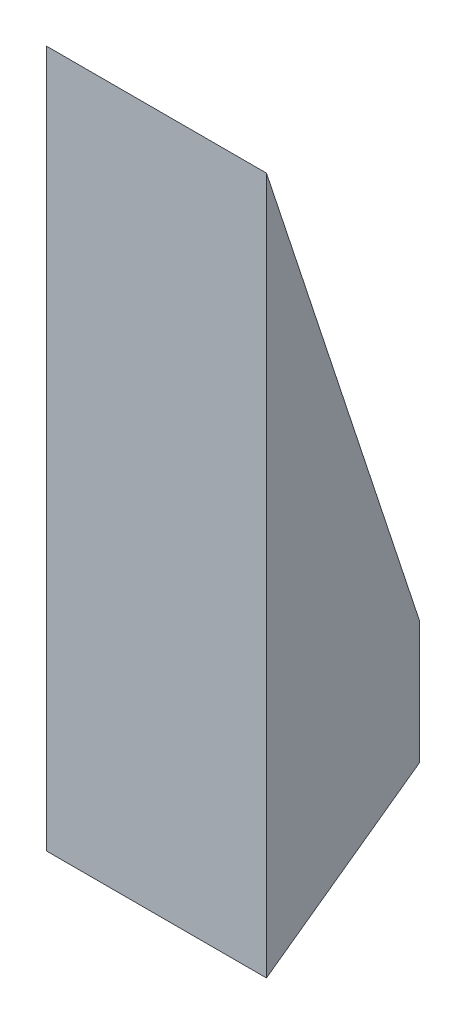
ISO-10303-21;
HEADER;
FILE_DESCRIPTION(('STEP AP214'),'2;1');
FILE_NAME('part.step','',(''),(''),'','','');
FILE_SCHEMA(('AUTOMOTIVE_DESIGN { 1 0 10303 214 1 1 1 1 }'));
ENDSEC;
DATA;
#1=APPLICATION_CONTEXT('core data for automotive mechanical design processes');
#2=APPLICATION_PROTOCOL_DEFINITION('international standard','automotive_design',2000,#1);
#3=PRODUCT_CONTEXT('',#1,'mechanical');
#4=PRODUCT('Part','Part','',(#3));
#5=PRODUCT_RELATED_PRODUCT_CATEGORY('part','',(#4));
#6=PRODUCT_DEFINITION_FORMATION('','',#4);
#7=PRODUCT_DEFINITION_CONTEXT('part definition',#1,'design');
#8=PRODUCT_DEFINITION('design','',#6,#7);
#9=PRODUCT_DEFINITION_SHAPE('','',#8);
#10=(LENGTH_UNIT() NAMED_UNIT(*) SI_UNIT(.MILLI.,.METRE.));
#11=(NAMED_UNIT(*) PLANE_ANGLE_UNIT() SI_UNIT($,.RADIAN.));
#12=(NAMED_UNIT(*) SI_UNIT($,.STERADIAN.) SOLID_ANGLE_UNIT());
#13=UNCERTAINTY_MEASURE_WITH_UNIT(LENGTH_MEASURE(1.E-05),#10,'distance_accuracy_value','');
#14=(GEOMETRIC_REPRESENTATION_CONTEXT(3) GLOBAL_UNCERTAINTY_ASSIGNED_CONTEXT((#13)) GLOBAL_UNIT_ASSIGNED_CONTEXT((#10,
#11,#12)) REPRESENTATION_CONTEXT('',''));
#15=CARTESIAN_POINT('',(0.,0.,0.));
#16=DIRECTION('',(0.,0.,1.));
#17=DIRECTION('',(1.,0.,0.));
#18=AXIS2_PLACEMENT_3D('',#15,#16,#17);
#19=CARTESIAN_POINT('',(-25.1547634408609,172.,0.771428571428577));
#20=DIRECTION('',(0.922618279569573,0.,0.385714285714285));
#21=DIRECTION('',(0.385714285714285,0.,-0.922618279569573));
#22=AXIS2_PLACEMENT_3D('',#19,#20,#21);
#23=PLANE('',#22);
#24=DIRECTION('',(0.171515885688825,-0.895694069708309,-0.410261422078344));
#25=VECTOR('',#24,1.);
#26=CARTESIAN_POINT('',(-29.6584249047305,166.203325145006,11.544066623619));
#27=LINE('',#26,#25);
#28=CARTESIAN_POINT('',(-23.996126531634,136.633544752169,-1.99999999999999));
#29=VERTEX_POINT('',#28);
#30=CARTESIAN_POINT('',(0.,11.3204395314139,-59.3980943846849));
#31=VERTEX_POINT('',#30);
#32=EDGE_CURVE('E63',#29,#31,#27,.T.);
#33=ORIENTED_EDGE('',*,*,#32,.F.);
#34=DIRECTION('',(0.,-1.,0.));
#35=VECTOR('',#34,1.);
#36=CARTESIAN_POINT('',(-23.996126531634,172.,-1.99999999999999));
#37=LINE('',#36,#35);
#38=CARTESIAN_POINT('',(-23.996126531634,2.,-1.99999999999999));
#39=VERTEX_POINT('',#38);
#40=EDGE_CURVE('E127',#29,#39,#37,.T.);
#41=ORIENTED_EDGE('',*,*,#40,.T.);
#42=DIRECTION('',(-0.385714285714285,0.,0.922618279569573));
#43=VECTOR('',#42,1.);
#44=CARTESIAN_POINT('',(-25.1547634408609,2.,0.771428571428577));
#45=LINE('',#44,#43);
#46=CARTESIAN_POINT('',(0.,2.,-59.3980943846849));
#47=VERTEX_POINT('',#46);
#48=EDGE_CURVE('E190',#47,#39,#45,.T.);
#49=ORIENTED_EDGE('',*,*,#48,.F.);
#50=DIRECTION('',(0.,-1.,0.));
#51=VECTOR('',#50,1.);
#52=CARTESIAN_POINT('',(0.,172.,-59.3980943846849));
#53=LINE('',#52,#51);
#54=EDGE_CURVE('E70',#31,#47,#53,.T.);
#55=ORIENTED_EDGE('',*,*,#54,.F.);
#56=EDGE_LOOP('',(#33,#41,#49,#55));
#57=FACE_BOUND('',#56,.T.);
#58=ADVANCED_FACE('F45',(#57),#23,.T.);
#59=CARTESIAN_POINT('',(27.,172.,-2.00000000000001));
#60=DIRECTION('',(0.,0.,-1.));
#61=DIRECTION('',(-1.,0.,0.));
#62=AXIS2_PLACEMENT_3D('',#59,#60,#61);
#63=PLANE('',#62);
#64=DIRECTION('',(-1.,0.,0.));
#65=VECTOR('',#64,1.);
#66=CARTESIAN_POINT('',(27.,136.633544752169,-2.00000000000001));
#67=LINE('',#66,#65);
#68=CARTESIAN_POINT('',(23.9961265316339,136.633544752169,-2.00000000000001));
#69=VERTEX_POINT('',#68);
#70=EDGE_CURVE('E216',#69,#29,#67,.T.);
#71=ORIENTED_EDGE('',*,*,#70,.F.);
#72=DIRECTION('',(0.,-1.,0.));
#73=VECTOR('',#72,1.);
#74=CARTESIAN_POINT('',(23.9961265316339,172.,-2.00000000000001));
#75=LINE('',#74,#73);
#76=CARTESIAN_POINT('',(23.9961265316339,2.,-2.00000000000001));
#77=VERTEX_POINT('',#76);
#78=EDGE_CURVE('E197',#69,#77,#75,.T.);
#79=ORIENTED_EDGE('',*,*,#78,.T.);
#80=DIRECTION('',(1.,0.,0.));
#81=VECTOR('',#80,1.);
#82=CARTESIAN_POINT('',(27.,2.,-2.00000000000001));
#83=LINE('',#82,#81);
#84=EDGE_CURVE('E194',#39,#77,#83,.T.);
#85=ORIENTED_EDGE('',*,*,#84,.F.);
#86=ORIENTED_EDGE('',*,*,#40,.F.);
#87=EDGE_LOOP('',(#71,#79,#85,#86));
#88=FACE_BOUND('',#87,.T.);
#89=ADVANCED_FACE('F215',(#88),#63,.T.);
#90=CARTESIAN_POINT('',(25.1547634408609,172.,0.771428571428562));
#91=DIRECTION('',(-0.922618279569573,0.,0.385714285714286));
#92=DIRECTION('',(0.385714285714286,0.,0.922618279569573));
#93=AXIS2_PLACEMENT_3D('',#90,#91,#92);
#94=PLANE('',#93);
#95=DIRECTION('',(0.171515885688825,0.895694069708309,0.410261422078344));
#96=VECTOR('',#95,1.);
#97=CARTESIAN_POINT('',(29.6584249047305,166.203325145006,11.544066623619));
#98=LINE('',#97,#96);
#99=EDGE_CURVE('E218',#31,#69,#98,.T.);
#100=ORIENTED_EDGE('',*,*,#99,.F.);
#101=ORIENTED_EDGE('',*,*,#54,.T.);
#102=DIRECTION('',(-0.385714285714286,0.,-0.922618279569573));
#103=VECTOR('',#102,1.);
#104=CARTESIAN_POINT('',(25.1547634408609,2.,0.771428571428562));
#105=LINE('',#104,#103);
#106=EDGE_CURVE('E200',#77,#47,#105,.T.);
#107=ORIENTED_EDGE('',*,*,#106,.F.);
#108=ORIENTED_EDGE('',*,*,#78,.F.);
#109=EDGE_LOOP('',(#100,#101,#107,#108));
#110=FACE_BOUND('',#109,.T.);
#111=ADVANCED_FACE('F217',(#110),#94,.T.);
#112=CARTESIAN_POINT('',(0.,2.,0.));
#113=DIRECTION('',(0.,1.,0.));
#114=DIRECTION('',(0.,0.,1.));
#115=AXIS2_PLACEMENT_3D('',#112,#113,#114);
#116=PLANE('',#115);
#117=CARTESIAN_POINT('',(4.16528467062881E-13,2.,-8.78797738539668));
#118=DIRECTION('',(0.,1.,0.));
#119=DIRECTION('',(0.,0.,1.));
#120=AXIS2_PLACEMENT_3D('',#117,#118,#119);
#121=CIRCLE('',#120,3.75);
#122=CARTESIAN_POINT('',(4.16528467062881E-13,2.,-5.03797738539667));
#123=VERTEX_POINT('',#122);
#124=EDGE_CURVE('E49',#123,#123,#121,.F.);
#125=ORIENTED_EDGE('',*,*,#124,.T.);
#126=EDGE_LOOP('',(#125));
#127=FACE_BOUND('',#126,.T.);
#128=CARTESIAN_POINT('',(10.0000000000003,2.,-18.7879773853967));
#129=DIRECTION('',(0.,1.,0.));
#130=DIRECTION('',(0.,0.,1.));
#131=AXIS2_PLACEMENT_3D('',#128,#129,#130);
#132=CIRCLE('',#131,3.75);
#133=CARTESIAN_POINT('',(10.0000000000003,2.,-15.0379773853967));
#134=VERTEX_POINT('',#133);
#135=EDGE_CURVE('E167',#134,#134,#132,.F.);
#136=ORIENTED_EDGE('',*,*,#135,.T.);
#137=EDGE_LOOP('',(#136));
#138=FACE_BOUND('',#137,.T.);
#139=CARTESIAN_POINT('',(-9.99999999999969,2.,-18.7879773853966));
#140=DIRECTION('',(0.,1.,0.));
#141=DIRECTION('',(0.,0.,1.));
#142=AXIS2_PLACEMENT_3D('',#139,#140,#141);
#143=CIRCLE('',#142,3.75);
#144=CARTESIAN_POINT('',(-9.99999999999969,2.,-15.0379773853966));
#145=VERTEX_POINT('',#144);
#146=EDGE_CURVE('E164',#145,#145,#143,.F.);
#147=ORIENTED_EDGE('',*,*,#146,.T.);
#148=EDGE_LOOP('',(#147));
#149=FACE_BOUND('',#148,.T.);
#150=CARTESIAN_POINT('',(-7.99999999999979,2.,-28.7879773853966));
#151=DIRECTION('',(0.,1.,0.));
#152=DIRECTION('',(0.,0.,1.));
#153=AXIS2_PLACEMENT_3D('',#150,#151,#152);
#154=CIRCLE('',#153,3.75);
#155=CARTESIAN_POINT('',(-7.99999999999979,2.,-25.0379773853966));
#156=VERTEX_POINT('',#155);
#157=EDGE_CURVE('E160',#156,#156,#154,.F.);
#158=ORIENTED_EDGE('',*,*,#157,.T.);
#159=EDGE_LOOP('',(#158));
#160=FACE_BOUND('',#159,.T.);
#161=CARTESIAN_POINT('',(0.,2.,-48.7879773853967));
#162=DIRECTION('',(0.,1.,0.));
#163=DIRECTION('',(0.,0.,1.));
#164=AXIS2_PLACEMENT_3D('',#161,#162,#163);
#165=CIRCLE('',#164,3.75);
#166=CARTESIAN_POINT('',(0.,2.,-45.0379773853967));
#167=VERTEX_POINT('',#166);
#168=EDGE_CURVE('E156',#167,#167,#165,.F.);
#169=ORIENTED_EDGE('',*,*,#168,.T.);
#170=EDGE_LOOP('',(#169));
#171=FACE_BOUND('',#170,.T.);
#172=CARTESIAN_POINT('',(1.0413211676572E-13,2.,-38.7879773853967));
#173=DIRECTION('',(0.,1.,0.));
#174=DIRECTION('',(0.,0.,1.));
#175=AXIS2_PLACEMENT_3D('',#172,#173,#174);
#176=CIRCLE('',#175,3.75);
#177=CARTESIAN_POINT('',(1.0413211676572E-13,2.,-35.0379773853967));
#178=VERTEX_POINT('',#177);
#179=EDGE_CURVE('E152',#178,#178,#176,.F.);
#180=ORIENTED_EDGE('',*,*,#179,.T.);
#181=EDGE_LOOP('',(#180));
#182=FACE_BOUND('',#181,.T.);
#183=CARTESIAN_POINT('',(2.08264233531441E-13,2.,-28.7879773853967));
#184=DIRECTION('',(0.,1.,0.));
#185=DIRECTION('',(0.,0.,1.));
#186=AXIS2_PLACEMENT_3D('',#183,#184,#185);
#187=CIRCLE('',#186,3.75);
#188=CARTESIAN_POINT('',(2.08264233531441E-13,2.,-25.0379773853967));
#189=VERTEX_POINT('',#188);
#190=EDGE_CURVE('E148',#189,#189,#187,.F.);
#191=ORIENTED_EDGE('',*,*,#190,.T.);
#192=EDGE_LOOP('',(#191));
#193=FACE_BOUND('',#192,.T.);
#194=CARTESIAN_POINT('',(8.00000000000021,2.,-28.7879773853967));
#195=DIRECTION('',(0.,1.,0.));
#196=DIRECTION('',(0.,0.,1.));
#197=AXIS2_PLACEMENT_3D('',#194,#195,#196);
#198=CIRCLE('',#197,3.75);
#199=CARTESIAN_POINT('',(8.00000000000021,2.,-25.0379773853967));
#200=VERTEX_POINT('',#199);
#201=EDGE_CURVE('E144',#200,#200,#198,.F.);
#202=ORIENTED_EDGE('',*,*,#201,.T.);
#203=EDGE_LOOP('',(#202));
#204=FACE_BOUND('',#203,.T.);
#205=CARTESIAN_POINT('',(-9.99999999999958,2.,-8.78797738539661));
#206=DIRECTION('',(0.,1.,0.));
#207=DIRECTION('',(0.,0.,1.));
#208=AXIS2_PLACEMENT_3D('',#205,#206,#207);
#209=CIRCLE('',#208,3.75);
#210=CARTESIAN_POINT('',(-9.99999999999958,2.,-5.03797738539661));
#211=VERTEX_POINT('',#210);
#212=EDGE_CURVE('E140',#211,#211,#209,.F.);
#213=ORIENTED_EDGE('',*,*,#212,.T.);
#214=EDGE_LOOP('',(#213));
#215=FACE_BOUND('',#214,.T.);
#216=CARTESIAN_POINT('',(10.0000000000004,2.,-8.78797738539668));
#217=DIRECTION('',(0.,1.,0.));
#218=DIRECTION('',(0.,0.,1.));
#219=AXIS2_PLACEMENT_3D('',#216,#217,#218);
#220=CIRCLE('',#219,3.75);
#221=CARTESIAN_POINT('',(10.0000000000004,2.,-5.03797738539668));
#222=VERTEX_POINT('',#221);
#223=EDGE_CURVE('E135',#222,#222,#220,.F.);
#224=ORIENTED_EDGE('',*,*,#223,.T.);
#225=EDGE_LOOP('',(#224));
#226=FACE_BOUND('',#225,.T.);
#227=CARTESIAN_POINT('',(3.12396350297161E-13,2.,-18.7879773853967));
#228=DIRECTION('',(0.,1.,0.));
#229=DIRECTION('',(0.,0.,1.));
#230=AXIS2_PLACEMENT_3D('',#227,#228,#229);
#231=CIRCLE('',#230,3.75);
#232=CARTESIAN_POINT('',(3.12396350297161E-13,2.,-15.0379773853967));
#233=VERTEX_POINT('',#232);
#234=EDGE_CURVE('E131',#233,#233,#231,.F.);
#235=ORIENTED_EDGE('',*,*,#234,.T.);
#236=EDGE_LOOP('',(#235));
#237=FACE_BOUND('',#236,.T.);
#238=ORIENTED_EDGE('',*,*,#48,.T.);
#239=ORIENTED_EDGE('',*,*,#84,.T.);
#240=ORIENTED_EDGE('',*,*,#106,.T.);
#241=EDGE_LOOP('',(#238,#239,#240));
#242=FACE_BOUND('',#241,.T.);
#243=ADVANCED_FACE('F208',(#127,#138,#149,#160,#171,#182,#193,#204,#215,#226,#237,#242),#116,.T.);
#244=CARTESIAN_POINT('',(3.12396350297161E-13,172.,-18.7879773853967));
#245=DIRECTION('',(0.,-1.,0.));
#246=DIRECTION('',(0.,0.,-1.));
#247=AXIS2_PLACEMENT_3D('',#244,#245,#246);
#248=CYLINDRICAL_SURFACE('',#247,3.75);
#249=ORIENTED_EDGE('',*,*,#234,.F.);
#250=EDGE_LOOP('',(#249));
#251=FACE_BOUND('',#250,.T.);
#252=CARTESIAN_POINT('',(3.12396350297161E-13,-23.,-18.7879773853967));
#253=DIRECTION('',(0.,1.,0.));
#254=DIRECTION('',(0.,0.,1.));
#255=AXIS2_PLACEMENT_3D('',#252,#253,#254);
#256=CIRCLE('',#255,3.75);
#257=CARTESIAN_POINT('',(3.12396350297161E-13,-23.,-15.0379773853967));
#258=VERTEX_POINT('',#257);
#259=EDGE_CURVE('E136',#258,#258,#256,.T.);
#260=ORIENTED_EDGE('',*,*,#259,.F.);
#261=EDGE_LOOP('',(#260));
#262=FACE_BOUND('',#261,.T.);
#263=ADVANCED_FACE('F299',(#251,#262),#248,.F.);
#264=CARTESIAN_POINT('',(3.12396350297161E-13,-23.,-18.7879773853967));
#265=DIRECTION('',(0.,1.,0.));
#266=DIRECTION('',(0.,0.,1.));
#267=AXIS2_PLACEMENT_3D('',#264,#265,#266);
#268=PLANE('',#267);
#269=ORIENTED_EDGE('',*,*,#259,.T.);
#270=EDGE_LOOP('',(#269));
#271=FACE_BOUND('',#270,.T.);
#272=ADVANCED_FACE('F329',(#271),#268,.T.);
#273=CARTESIAN_POINT('',(10.0000000000004,172.,-8.78797738539668));
#274=DIRECTION('',(0.,-1.,0.));
#275=DIRECTION('',(0.,0.,-1.));
#276=AXIS2_PLACEMENT_3D('',#273,#274,#275);
#277=CYLINDRICAL_SURFACE('',#276,3.75);
#278=ORIENTED_EDGE('',*,*,#223,.F.);
#279=EDGE_LOOP('',(#278));
#280=FACE_BOUND('',#279,.T.);
#281=CARTESIAN_POINT('',(10.0000000000004,-23.,-8.78797738539668));
#282=DIRECTION('',(0.,1.,0.));
#283=DIRECTION('',(0.,0.,1.));
#284=AXIS2_PLACEMENT_3D('',#281,#282,#283);
#285=CIRCLE('',#284,3.75);
#286=CARTESIAN_POINT('',(10.0000000000004,-23.,-5.03797738539668));
#287=VERTEX_POINT('',#286);
#288=EDGE_CURVE('E110',#287,#287,#285,.T.);
#289=ORIENTED_EDGE('',*,*,#288,.F.);
#290=EDGE_LOOP('',(#289));
#291=FACE_BOUND('',#290,.T.);
#292=ADVANCED_FACE('F326',(#280,#291),#277,.F.);
#293=CARTESIAN_POINT('',(10.0000000000004,-23.,-8.78797738539668));
#294=DIRECTION('',(0.,1.,0.));
#295=DIRECTION('',(0.,0.,1.));
#296=AXIS2_PLACEMENT_3D('',#293,#294,#295);
#297=PLANE('',#296);
#298=ORIENTED_EDGE('',*,*,#288,.T.);
#299=EDGE_LOOP('',(#298));
#300=FACE_BOUND('',#299,.T.);
#301=ADVANCED_FACE('F320',(#300),#297,.T.);
#302=CARTESIAN_POINT('',(-9.99999999999958,172.,-8.78797738539661));
#303=DIRECTION('',(0.,-1.,0.));
#304=DIRECTION('',(0.,0.,-1.));
#305=AXIS2_PLACEMENT_3D('',#302,#303,#304);
#306=CYLINDRICAL_SURFACE('',#305,3.75);
#307=ORIENTED_EDGE('',*,*,#212,.F.);
#308=EDGE_LOOP('',(#307));
#309=FACE_BOUND('',#308,.T.);
#310=CARTESIAN_POINT('',(-9.99999999999958,-23.,-8.78797738539661));
#311=DIRECTION('',(0.,1.,0.));
#312=DIRECTION('',(0.,0.,1.));
#313=AXIS2_PLACEMENT_3D('',#310,#311,#312);
#314=CIRCLE('',#313,3.75);
#315=CARTESIAN_POINT('',(-9.99999999999958,-23.,-5.03797738539661));
#316=VERTEX_POINT('',#315);
#317=EDGE_CURVE('E228',#316,#316,#314,.T.);
#318=ORIENTED_EDGE('',*,*,#317,.F.);
#319=EDGE_LOOP('',(#318));
#320=FACE_BOUND('',#319,.T.);
#321=ADVANCED_FACE('F316',(#309,#320),#306,.F.);
#322=CARTESIAN_POINT('',(-9.99999999999958,-23.,-8.78797738539661));
#323=DIRECTION('',(0.,1.,0.));
#324=DIRECTION('',(0.,0.,1.));
#325=AXIS2_PLACEMENT_3D('',#322,#323,#324);
#326=PLANE('',#325);
#327=ORIENTED_EDGE('',*,*,#317,.T.);
#328=EDGE_LOOP('',(#327));
#329=FACE_BOUND('',#328,.T.);
#330=ADVANCED_FACE('F319',(#329),#326,.T.);
#331=CARTESIAN_POINT('',(8.00000000000021,172.,-28.7879773853967));
#332=DIRECTION('',(0.,-1.,0.));
#333=DIRECTION('',(0.,0.,-1.));
#334=AXIS2_PLACEMENT_3D('',#331,#332,#333);
#335=CYLINDRICAL_SURFACE('',#334,3.75);
#336=ORIENTED_EDGE('',*,*,#201,.F.);
#337=EDGE_LOOP('',(#336));
#338=FACE_BOUND('',#337,.T.);
#339=CARTESIAN_POINT('',(8.00000000000021,-23.,-28.7879773853967));
#340=DIRECTION('',(0.,1.,0.));
#341=DIRECTION('',(0.,0.,1.));
#342=AXIS2_PLACEMENT_3D('',#339,#340,#341);
#343=CIRCLE('',#342,3.75);
#344=CARTESIAN_POINT('',(8.00000000000021,-23.,-25.0379773853967));
#345=VERTEX_POINT('',#344);
#346=EDGE_CURVE('E252',#345,#345,#343,.T.);
#347=ORIENTED_EDGE('',*,*,#346,.F.);
#348=EDGE_LOOP('',(#347));
#349=FACE_BOUND('',#348,.T.);
#350=ADVANCED_FACE('F324',(#338,#349),#335,.F.);
#351=CARTESIAN_POINT('',(8.00000000000021,-23.,-28.7879773853967));
#352=DIRECTION('',(0.,1.,0.));
#353=DIRECTION('',(0.,0.,1.));
#354=AXIS2_PLACEMENT_3D('',#351,#352,#353);
#355=PLANE('',#354);
#356=ORIENTED_EDGE('',*,*,#346,.T.);
#357=EDGE_LOOP('',(#356));
#358=FACE_BOUND('',#357,.T.);
#359=ADVANCED_FACE('F362',(#358),#355,.T.);
#360=CARTESIAN_POINT('',(2.08264233531441E-13,172.,-28.7879773853967));
#361=DIRECTION('',(0.,-1.,0.));
#362=DIRECTION('',(0.,0.,-1.));
#363=AXIS2_PLACEMENT_3D('',#360,#361,#362);
#364=CYLINDRICAL_SURFACE('',#363,3.75);
#365=ORIENTED_EDGE('',*,*,#190,.F.);
#366=EDGE_LOOP('',(#365));
#367=FACE_BOUND('',#366,.T.);
#368=CARTESIAN_POINT('',(2.08264233531441E-13,-23.,-28.7879773853967));
#369=DIRECTION('',(0.,1.,0.));
#370=DIRECTION('',(0.,0.,1.));
#371=AXIS2_PLACEMENT_3D('',#368,#369,#370);
#372=CIRCLE('',#371,3.75);
#373=CARTESIAN_POINT('',(2.08264233531441E-13,-23.,-25.0379773853967));
#374=VERTEX_POINT('',#373);
#375=EDGE_CURVE('E256',#374,#374,#372,.T.);
#376=ORIENTED_EDGE('',*,*,#375,.F.);
#377=EDGE_LOOP('',(#376));
#378=FACE_BOUND('',#377,.T.);
#379=ADVANCED_FACE('F366',(#367,#378),#364,.F.);
#380=CARTESIAN_POINT('',(2.08264233531441E-13,-23.,-28.7879773853967));
#381=DIRECTION('',(0.,1.,0.));
#382=DIRECTION('',(0.,0.,1.));
#383=AXIS2_PLACEMENT_3D('',#380,#381,#382);
#384=PLANE('',#383);
#385=ORIENTED_EDGE('',*,*,#375,.T.);
#386=EDGE_LOOP('',(#385));
#387=FACE_BOUND('',#386,.T.);
#388=ADVANCED_FACE('F370',(#387),#384,.T.);
#389=CARTESIAN_POINT('',(1.0413211676572E-13,172.,-38.7879773853967));
#390=DIRECTION('',(0.,-1.,0.));
#391=DIRECTION('',(0.,0.,-1.));
#392=AXIS2_PLACEMENT_3D('',#389,#390,#391);
#393=CYLINDRICAL_SURFACE('',#392,3.75);
#394=ORIENTED_EDGE('',*,*,#179,.F.);
#395=EDGE_LOOP('',(#394));
#396=FACE_BOUND('',#395,.T.);
#397=CARTESIAN_POINT('',(1.0413211676572E-13,-23.,-38.7879773853967));
#398=DIRECTION('',(0.,1.,0.));
#399=DIRECTION('',(0.,0.,1.));
#400=AXIS2_PLACEMENT_3D('',#397,#398,#399);
#401=CIRCLE('',#400,3.75);
#402=CARTESIAN_POINT('',(1.0413211676572E-13,-23.,-35.0379773853967));
#403=VERTEX_POINT('',#402);
#404=EDGE_CURVE('E260',#403,#403,#401,.T.);
#405=ORIENTED_EDGE('',*,*,#404,.F.);
#406=EDGE_LOOP('',(#405));
#407=FACE_BOUND('',#406,.T.);
#408=ADVANCED_FACE('F280',(#396,#407),#393,.F.);
#409=CARTESIAN_POINT('',(1.0413211676572E-13,-23.,-38.7879773853967));
#410=DIRECTION('',(0.,1.,0.));
#411=DIRECTION('',(0.,0.,1.));
#412=AXIS2_PLACEMENT_3D('',#409,#410,#411);
#413=PLANE('',#412);
#414=ORIENTED_EDGE('',*,*,#404,.T.);
#415=EDGE_LOOP('',(#414));
#416=FACE_BOUND('',#415,.T.);
#417=ADVANCED_FACE('F271',(#416),#413,.T.);
#418=CARTESIAN_POINT('',(0.,172.,-48.7879773853967));
#419=DIRECTION('',(0.,-1.,0.));
#420=DIRECTION('',(0.,0.,-1.));
#421=AXIS2_PLACEMENT_3D('',#418,#419,#420);
#422=CYLINDRICAL_SURFACE('',#421,3.75);
#423=ORIENTED_EDGE('',*,*,#168,.F.);
#424=EDGE_LOOP('',(#423));
#425=FACE_BOUND('',#424,.T.);
#426=CARTESIAN_POINT('',(0.,-23.,-48.7879773853967));
#427=DIRECTION('',(0.,1.,0.));
#428=DIRECTION('',(0.,0.,1.));
#429=AXIS2_PLACEMENT_3D('',#426,#427,#428);
#430=CIRCLE('',#429,3.75);
#431=CARTESIAN_POINT('',(0.,-23.,-45.0379773853967));
#432=VERTEX_POINT('',#431);
#433=EDGE_CURVE('E240',#432,#432,#430,.T.);
#434=ORIENTED_EDGE('',*,*,#433,.F.);
#435=EDGE_LOOP('',(#434));
#436=FACE_BOUND('',#435,.T.);
#437=ADVANCED_FACE('F269',(#425,#436),#422,.F.);
#438=CARTESIAN_POINT('',(0.,-23.,-48.7879773853967));
#439=DIRECTION('',(0.,1.,0.));
#440=DIRECTION('',(0.,0.,1.));
#441=AXIS2_PLACEMENT_3D('',#438,#439,#440);
#442=PLANE('',#441);
#443=ORIENTED_EDGE('',*,*,#433,.T.);
#444=EDGE_LOOP('',(#443));
#445=FACE_BOUND('',#444,.T.);
#446=ADVANCED_FACE('F267',(#445),#442,.T.);
#447=CARTESIAN_POINT('',(-7.99999999999979,172.,-28.7879773853966));
#448=DIRECTION('',(0.,-1.,0.));
#449=DIRECTION('',(0.,0.,-1.));
#450=AXIS2_PLACEMENT_3D('',#447,#448,#449);
#451=CYLINDRICAL_SURFACE('',#450,3.75);
#452=ORIENTED_EDGE('',*,*,#157,.F.);
#453=EDGE_LOOP('',(#452));
#454=FACE_BOUND('',#453,.T.);
#455=CARTESIAN_POINT('',(-7.99999999999979,-23.,-28.7879773853966));
#456=DIRECTION('',(0.,1.,0.));
#457=DIRECTION('',(0.,0.,1.));
#458=AXIS2_PLACEMENT_3D('',#455,#456,#457);
#459=CIRCLE('',#458,3.75);
#460=CARTESIAN_POINT('',(-7.99999999999979,-23.,-25.0379773853966));
#461=VERTEX_POINT('',#460);
#462=EDGE_CURVE('E236',#461,#461,#459,.T.);
#463=ORIENTED_EDGE('',*,*,#462,.F.);
#464=EDGE_LOOP('',(#463));
#465=FACE_BOUND('',#464,.T.);
#466=ADVANCED_FACE('F278',(#454,#465),#451,.F.);
#467=CARTESIAN_POINT('',(-7.99999999999979,-23.,-28.7879773853966));
#468=DIRECTION('',(0.,1.,0.));
#469=DIRECTION('',(0.,0.,1.));
#470=AXIS2_PLACEMENT_3D('',#467,#468,#469);
#471=PLANE('',#470);
#472=ORIENTED_EDGE('',*,*,#462,.T.);
#473=EDGE_LOOP('',(#472));
#474=FACE_BOUND('',#473,.T.);
#475=ADVANCED_FACE('F336',(#474),#471,.T.);
#476=CARTESIAN_POINT('',(-9.99999999999969,172.,-18.7879773853966));
#477=DIRECTION('',(0.,-1.,0.));
#478=DIRECTION('',(0.,0.,-1.));
#479=AXIS2_PLACEMENT_3D('',#476,#477,#478);
#480=CYLINDRICAL_SURFACE('',#479,3.75);
#481=ORIENTED_EDGE('',*,*,#146,.F.);
#482=EDGE_LOOP('',(#481));
#483=FACE_BOUND('',#482,.T.);
#484=CARTESIAN_POINT('',(-9.99999999999969,-23.,-18.7879773853966));
#485=DIRECTION('',(0.,1.,0.));
#486=DIRECTION('',(0.,0.,1.));
#487=AXIS2_PLACEMENT_3D('',#484,#485,#486);
#488=CIRCLE('',#487,3.75);
#489=CARTESIAN_POINT('',(-9.99999999999969,-23.,-15.0379773853966));
#490=VERTEX_POINT('',#489);
#491=EDGE_CURVE('E241',#490,#490,#488,.T.);
#492=ORIENTED_EDGE('',*,*,#491,.F.);
#493=EDGE_LOOP('',(#492));
#494=FACE_BOUND('',#493,.T.);
#495=ADVANCED_FACE('F340',(#483,#494),#480,.F.);
#496=CARTESIAN_POINT('',(-9.99999999999969,-23.,-18.7879773853966));
#497=DIRECTION('',(0.,1.,0.));
#498=DIRECTION('',(0.,0.,1.));
#499=AXIS2_PLACEMENT_3D('',#496,#497,#498);
#500=PLANE('',#499);
#501=ORIENTED_EDGE('',*,*,#491,.T.);
#502=EDGE_LOOP('',(#501));
#503=FACE_BOUND('',#502,.T.);
#504=ADVANCED_FACE('F344',(#503),#500,.T.);
#505=CARTESIAN_POINT('',(10.0000000000003,172.,-18.7879773853967));
#506=DIRECTION('',(0.,-1.,0.));
#507=DIRECTION('',(0.,0.,-1.));
#508=AXIS2_PLACEMENT_3D('',#505,#506,#507);
#509=CYLINDRICAL_SURFACE('',#508,3.75);
#510=ORIENTED_EDGE('',*,*,#135,.F.);
#511=EDGE_LOOP('',(#510));
#512=FACE_BOUND('',#511,.T.);
#513=CARTESIAN_POINT('',(10.0000000000003,-23.,-18.7879773853967));
#514=DIRECTION('',(0.,1.,0.));
#515=DIRECTION('',(0.,0.,1.));
#516=AXIS2_PLACEMENT_3D('',#513,#514,#515);
#517=CIRCLE('',#516,3.75);
#518=CARTESIAN_POINT('',(10.0000000000003,-23.,-15.0379773853967));
#519=VERTEX_POINT('',#518);
#520=EDGE_CURVE('E245',#519,#519,#517,.T.);
#521=ORIENTED_EDGE('',*,*,#520,.F.);
#522=EDGE_LOOP('',(#521));
#523=FACE_BOUND('',#522,.T.);
#524=ADVANCED_FACE('F348',(#512,#523),#509,.F.);
#525=CARTESIAN_POINT('',(10.0000000000003,-23.,-18.7879773853967));
#526=DIRECTION('',(0.,1.,0.));
#527=DIRECTION('',(0.,0.,1.));
#528=AXIS2_PLACEMENT_3D('',#525,#526,#527);
#529=PLANE('',#528);
#530=ORIENTED_EDGE('',*,*,#520,.T.);
#531=EDGE_LOOP('',(#530));
#532=FACE_BOUND('',#531,.T.);
#533=ADVANCED_FACE('F352',(#532),#529,.T.);
#534=CARTESIAN_POINT('',(4.16528467062881E-13,172.,-8.78797738539668));
#535=DIRECTION('',(0.,-1.,0.));
#536=DIRECTION('',(0.,0.,-1.));
#537=AXIS2_PLACEMENT_3D('',#534,#535,#536);
#538=CYLINDRICAL_SURFACE('',#537,3.75);
#539=ORIENTED_EDGE('',*,*,#124,.F.);
#540=EDGE_LOOP('',(#539));
#541=FACE_BOUND('',#540,.T.);
#542=CARTESIAN_POINT('',(4.16528467062881E-13,-23.,-8.78797738539668));
#543=DIRECTION('',(0.,1.,0.));
#544=DIRECTION('',(0.,0.,1.));
#545=AXIS2_PLACEMENT_3D('',#542,#543,#544);
#546=CIRCLE('',#545,3.75);
#547=CARTESIAN_POINT('',(4.16528467062881E-13,-23.,-5.03797738539667));
#548=VERTEX_POINT('',#547);
#549=EDGE_CURVE('E232',#548,#548,#546,.T.);
#550=ORIENTED_EDGE('',*,*,#549,.F.);
#551=EDGE_LOOP('',(#550));
#552=FACE_BOUND('',#551,.T.);
#553=ADVANCED_FACE('F312',(#541,#552),#538,.F.);
#554=CARTESIAN_POINT('',(4.16528467062881E-13,-23.,-8.78797738539668));
#555=DIRECTION('',(0.,1.,0.));
#556=DIRECTION('',(0.,0.,1.));
#557=AXIS2_PLACEMENT_3D('',#554,#555,#556);
#558=PLANE('',#557);
#559=ORIENTED_EDGE('',*,*,#549,.T.);
#560=EDGE_LOOP('',(#559));
#561=FACE_BOUND('',#560,.T.);
#562=ADVANCED_FACE('F308',(#561),#558,.T.);
#563=CARTESIAN_POINT('',(-27.,141.,0.));
#564=DIRECTION('',(0.,-0.41643238604486,0.909166688706194));
#565=DIRECTION('',(0.,-0.909166688706194,-0.41643238604486));
#566=AXIS2_PLACEMENT_3D('',#563,#564,#565);
#567=PLANE('',#566);
#568=ORIENTED_EDGE('',*,*,#32,.T.);
#569=ORIENTED_EDGE('',*,*,#99,.T.);
#570=ORIENTED_EDGE('',*,*,#70,.T.);
#571=EDGE_LOOP('',(#568,#569,#570));
#572=FACE_BOUND('',#571,.T.);
#573=DIRECTION('',(1.,0.,0.));
#574=VECTOR('',#573,1.);
#575=CARTESIAN_POINT('',(-27.,141.,0.));
#576=LINE('',#575,#574);
#577=CARTESIAN_POINT('',(-27.,141.,0.));
#578=VERTEX_POINT('',#577);
#579=CARTESIAN_POINT('',(27.,141.,0.));
#580=VERTEX_POINT('',#579);
#581=EDGE_CURVE('E100',#578,#580,#576,.T.);
#582=ORIENTED_EDGE('',*,*,#581,.T.);
#583=DIRECTION('',(0.171515885688825,0.895694069708309,0.410261422078344));
#584=VECTOR('',#583,1.);
#585=CARTESIAN_POINT('',(31.7623986118397,165.87030386183,11.3915304063558));
#586=LINE('',#585,#584);
#587=CARTESIAN_POINT('',(0.,0.,-64.5832795698701));
#588=VERTEX_POINT('',#587);
#589=EDGE_CURVE('E103',#588,#580,#586,.T.);
#590=ORIENTED_EDGE('',*,*,#589,.F.);
#591=DIRECTION('',(0.171515885688825,-0.895694069708309,-0.410261422078344));
#592=VECTOR('',#591,1.);
#593=CARTESIAN_POINT('',(-31.7623986118397,165.87030386183,11.3915304063558));
#594=LINE('',#593,#592);
#595=EDGE_CURVE('E105',#578,#588,#594,.T.);
#596=ORIENTED_EDGE('',*,*,#595,.F.);
#597=EDGE_LOOP('',(#582,#590,#596));
#598=FACE_BOUND('',#597,.T.);
#599=ADVANCED_FACE('F102',(#572,#598),#567,.F.);
#600=CARTESIAN_POINT('',(0.,-30.,0.));
#601=DIRECTION('',(0.,1.,0.));
#602=DIRECTION('',(0.,0.,1.));
#603=AXIS2_PLACEMENT_3D('',#600,#601,#602);
#604=PLANE('',#603);
#605=DIRECTION('',(0.385714285714285,0.,-0.922618279569573));
#606=VECTOR('',#605,1.);
#607=CARTESIAN_POINT('',(0.,-30.,-64.5832795698701));
#608=LINE('',#607,#606);
#609=CARTESIAN_POINT('',(-27.,-30.,0.));
#610=VERTEX_POINT('',#609);
#611=CARTESIAN_POINT('',(0.,-30.,-64.5832795698701));
#612=VERTEX_POINT('',#611);
#613=EDGE_CURVE('E174',#610,#612,#608,.T.);
#614=ORIENTED_EDGE('',*,*,#613,.T.);
#615=DIRECTION('',(0.385714285714286,0.,0.922618279569573));
#616=VECTOR('',#615,1.);
#617=CARTESIAN_POINT('',(27.,-30.,0.));
#618=LINE('',#617,#616);
#619=CARTESIAN_POINT('',(27.,-30.,0.));
#620=VERTEX_POINT('',#619);
#621=EDGE_CURVE('E179',#612,#620,#618,.T.);
#622=ORIENTED_EDGE('',*,*,#621,.T.);
#623=DIRECTION('',(-1.,0.,0.));
#624=VECTOR('',#623,1.);
#625=CARTESIAN_POINT('',(-27.,-30.,0.));
#626=LINE('',#625,#624);
#627=EDGE_CURVE('E123',#620,#610,#626,.T.);
#628=ORIENTED_EDGE('',*,*,#627,.T.);
#629=EDGE_LOOP('',(#614,#622,#628));
#630=FACE_BOUND('',#629,.T.);
#631=ADVANCED_FACE('F292',(#630),#604,.F.);
#632=CARTESIAN_POINT('',(27.,172.,0.));
#633=DIRECTION('',(0.,0.,-1.));
#634=DIRECTION('',(-1.,0.,0.));
#635=AXIS2_PLACEMENT_3D('',#632,#633,#634);
#636=PLANE('',#635);
#637=DIRECTION('',(0.,-1.,0.));
#638=VECTOR('',#637,1.);
#639=CARTESIAN_POINT('',(27.,172.,0.));
#640=LINE('',#639,#638);
#641=EDGE_CURVE('E55',#580,#620,#640,.T.);
#642=ORIENTED_EDGE('',*,*,#641,.F.);
#643=ORIENTED_EDGE('',*,*,#581,.F.);
#644=DIRECTION('',(0.,-1.,0.));
#645=VECTOR('',#644,1.);
#646=CARTESIAN_POINT('',(-27.,172.,0.));
#647=LINE('',#646,#645);
#648=EDGE_CURVE('E11',#578,#610,#647,.T.);
#649=ORIENTED_EDGE('',*,*,#648,.T.);
#650=ORIENTED_EDGE('',*,*,#627,.F.);
#651=EDGE_LOOP('',(#642,#643,#649,#650));
#652=FACE_BOUND('',#651,.T.);
#653=ADVANCED_FACE('F121',(#652),#636,.F.);
#654=CARTESIAN_POINT('',(27.,172.,0.));
#655=DIRECTION('',(-0.922618279569573,0.,0.385714285714286));
#656=DIRECTION('',(0.385714285714286,0.,0.922618279569573));
#657=AXIS2_PLACEMENT_3D('',#654,#655,#656);
#658=PLANE('',#657);
#659=DIRECTION('',(0.,-1.,0.));
#660=VECTOR('',#659,1.);
#661=CARTESIAN_POINT('',(0.,172.,-64.5832795698701));
#662=LINE('',#661,#660);
#663=EDGE_CURVE('E117',#588,#612,#662,.T.);
#664=ORIENTED_EDGE('',*,*,#663,.F.);
#665=ORIENTED_EDGE('',*,*,#589,.T.);
#666=ORIENTED_EDGE('',*,*,#641,.T.);
#667=ORIENTED_EDGE('',*,*,#621,.F.);
#668=EDGE_LOOP('',(#664,#665,#666,#667));
#669=FACE_BOUND('',#668,.T.);
#670=ADVANCED_FACE('F114',(#669),#658,.F.);
#671=CARTESIAN_POINT('',(-27.,172.,0.));
#672=DIRECTION('',(0.922618279569573,0.,0.385714285714285));
#673=DIRECTION('',(0.385714285714285,0.,-0.922618279569573));
#674=AXIS2_PLACEMENT_3D('',#671,#672,#673);
#675=PLANE('',#674);
#676=ORIENTED_EDGE('',*,*,#648,.F.);
#677=ORIENTED_EDGE('',*,*,#595,.T.);
#678=ORIENTED_EDGE('',*,*,#663,.T.);
#679=ORIENTED_EDGE('',*,*,#613,.F.);
#680=EDGE_LOOP('',(#676,#677,#678,#679));
#681=FACE_BOUND('',#680,.T.);
#682=ADVANCED_FACE('F47',(#681),#675,.F.);
#683=CLOSED_SHELL('',(#58,#89,#111,#243,#263,#272,#292,#301,#321,#330,#350,#359,#379,#388,#408,
#417,#437,#446,#466,#475,#495,#504,#524,#533,#553,#562,#599,#631,#653,#670,#682));
#684=MANIFOLD_SOLID_BREP('B2',#683);
#685=ADVANCED_BREP_SHAPE_REPRESENTATION('',(#18,#684),#14);
#686=SHAPE_DEFINITION_REPRESENTATION(#9,#685);
ENDSEC;
END-ISO-10303-21;
